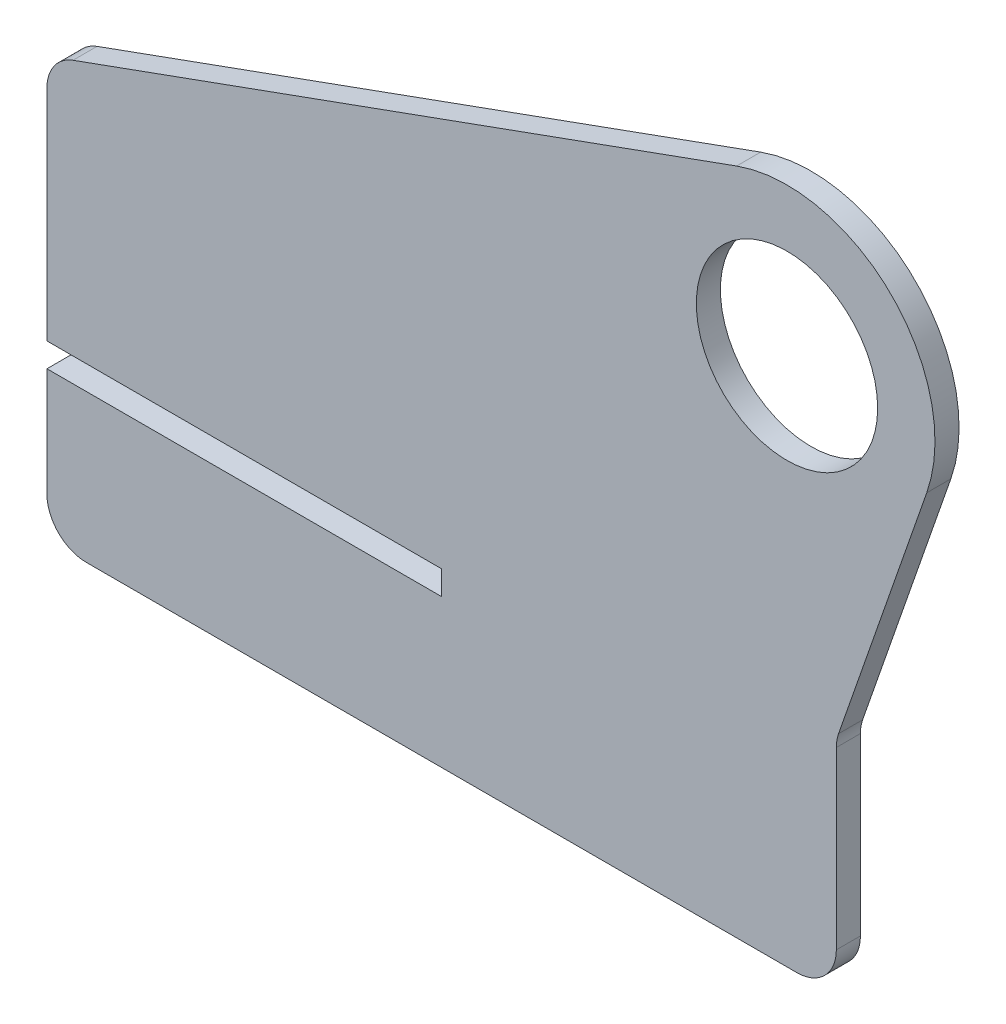
ISO-10303-21;
HEADER;
FILE_DESCRIPTION(('STEP AP214'),'2;1');
FILE_NAME('part.step','',(''),(''),'','','');
FILE_SCHEMA(('AUTOMOTIVE_DESIGN { 1 0 10303 214 1 1 1 1 }'));
ENDSEC;
DATA;
#1=APPLICATION_CONTEXT('core data for automotive mechanical design processes');
#2=APPLICATION_PROTOCOL_DEFINITION('international standard','automotive_design',2000,#1);
#3=PRODUCT_CONTEXT('',#1,'mechanical');
#4=PRODUCT('Part','Part','',(#3));
#5=PRODUCT_RELATED_PRODUCT_CATEGORY('part','',(#4));
#6=PRODUCT_DEFINITION_FORMATION('','',#4);
#7=PRODUCT_DEFINITION_CONTEXT('part definition',#1,'design');
#8=PRODUCT_DEFINITION('design','',#6,#7);
#9=PRODUCT_DEFINITION_SHAPE('','',#8);
#10=(LENGTH_UNIT() NAMED_UNIT(*) SI_UNIT(.MILLI.,.METRE.));
#11=(NAMED_UNIT(*) PLANE_ANGLE_UNIT() SI_UNIT($,.RADIAN.));
#12=(NAMED_UNIT(*) SI_UNIT($,.STERADIAN.) SOLID_ANGLE_UNIT());
#13=UNCERTAINTY_MEASURE_WITH_UNIT(LENGTH_MEASURE(1.E-05),#10,'distance_accuracy_value','');
#14=(GEOMETRIC_REPRESENTATION_CONTEXT(3) GLOBAL_UNCERTAINTY_ASSIGNED_CONTEXT((#13)) GLOBAL_UNIT_ASSIGNED_CONTEXT((#10,
#11,#12)) REPRESENTATION_CONTEXT('',''));
#15=CARTESIAN_POINT('',(0.,0.,0.));
#16=DIRECTION('',(0.,0.,1.));
#17=DIRECTION('',(1.,0.,0.));
#18=AXIS2_PLACEMENT_3D('',#15,#16,#17);
#19=CARTESIAN_POINT('',(0.,0.,3.0988));
#20=DIRECTION('',(0.,0.,-1.));
#21=DIRECTION('',(-1.,0.,0.));
#22=AXIS2_PLACEMENT_3D('',#19,#20,#21);
#23=PLANE('',#22);
#24=CARTESIAN_POINT('',(44.45,47.5190488120291,3.0988));
#25=DIRECTION('',(0.,0.,1.));
#26=DIRECTION('',(1.,0.,0.));
#27=AXIS2_PLACEMENT_3D('',#24,#25,#26);
#28=CIRCLE('',#27,11.6713);
#29=CARTESIAN_POINT('',(56.1213,47.5190488120291,3.0988));
#30=VERTEX_POINT('',#29);
#31=EDGE_CURVE('E170',#30,#30,#28,.T.);
#32=ORIENTED_EDGE('',*,*,#31,.F.);
#33=EDGE_LOOP('',(#32));
#34=FACE_BOUND('',#33,.T.);
#35=DIRECTION('',(1.,0.,0.));
#36=VECTOR('',#35,1.);
#37=CARTESIAN_POINT('',(0.,-20.5994,3.0988));
#38=LINE('',#37,#36);
#39=CARTESIAN_POINT('',(-45.72,-20.5994,3.0988));
#40=VERTEX_POINT('',#39);
#41=CARTESIAN_POINT('',(45.72,-20.5994,3.0988));
#42=VERTEX_POINT('',#41);
#43=EDGE_CURVE('E178',#40,#42,#38,.T.);
#44=ORIENTED_EDGE('',*,*,#43,.T.);
#45=CARTESIAN_POINT('',(45.72,-15.5194,3.0988));
#46=DIRECTION('',(0.,0.,-1.));
#47=DIRECTION('',(-1.,0.,0.));
#48=AXIS2_PLACEMENT_3D('',#45,#46,#47);
#49=CIRCLE('',#48,5.08);
#50=CARTESIAN_POINT('',(50.8,-15.5194,3.0988));
#51=VERTEX_POINT('',#50);
#52=EDGE_CURVE('E238',#42,#51,#49,.F.);
#53=ORIENTED_EDGE('',*,*,#52,.T.);
#54=DIRECTION('',(0.,-1.,0.));
#55=VECTOR('',#54,1.);
#56=CARTESIAN_POINT('',(50.8,0.,3.0988));
#57=LINE('',#56,#55);
#58=CARTESIAN_POINT('',(50.8,7.03843440850292,3.0988));
#59=VERTEX_POINT('',#58);
#60=EDGE_CURVE('E162',#59,#51,#57,.T.);
#61=ORIENTED_EDGE('',*,*,#60,.F.);
#62=CARTESIAN_POINT('',(55.88,7.03843440850291,3.0988));
#63=DIRECTION('',(0.,0.,-1.));
#64=DIRECTION('',(-1.,0.,0.));
#65=AXIS2_PLACEMENT_3D('',#62,#63,#64);
#66=CIRCLE('',#65,5.08);
#67=CARTESIAN_POINT('',(51.0836867309962,8.71228596272697,3.0988));
#68=VERTEX_POINT('',#67);
#69=EDGE_CURVE('E45',#59,#68,#66,.T.);
#70=ORIENTED_EDGE('',*,*,#69,.T.);
#71=DIRECTION('',(-0.32949833744568,-0.944156155315705,0.));
#72=VECTOR('',#71,1.);
#73=CARTESIAN_POINT('',(42.8272003368747,-14.9461413019488,3.0988));
#74=LINE('',#73,#72);
#75=CARTESIAN_POINT('',(62.4361747587642,41.2421054836889,3.0988));
#76=VERTEX_POINT('',#75);
#77=EDGE_CURVE('E166',#76,#68,#74,.T.);
#78=ORIENTED_EDGE('',*,*,#77,.F.);
#79=CARTESIAN_POINT('',(44.45,47.5190488120291,3.0988));
#80=DIRECTION('',(0.,0.,1.));
#81=DIRECTION('',(1.,0.,0.));
#82=AXIS2_PLACEMENT_3D('',#79,#80,#81);
#83=CIRCLE('',#82,19.05);
#84=CARTESIAN_POINT('',(37.9658806095995,65.4315778275263,3.0988));
#85=VERTEX_POINT('',#84);
#86=EDGE_CURVE('E153',#76,#85,#83,.T.);
#87=ORIENTED_EDGE('',*,*,#86,.T.);
#88=DIRECTION('',(-0.940290237033978,-0.340373721280868,0.));
#89=VECTOR('',#88,1.);
#90=CARTESIAN_POINT('',(-16.5428727921967,45.700066739764,3.0988));
#91=LINE('',#90,#89);
#92=CARTESIAN_POINT('',(-47.4490985041068,34.5123859131586,3.0988));
#93=VERTEX_POINT('',#92);
#94=EDGE_CURVE('E175',#85,#93,#91,.T.);
#95=ORIENTED_EDGE('',*,*,#94,.T.);
#96=CARTESIAN_POINT('',(-45.72,29.735711509026,3.0988));
#97=DIRECTION('',(0.,0.,-1.));
#98=DIRECTION('',(-1.,0.,0.));
#99=AXIS2_PLACEMENT_3D('',#96,#97,#98);
#100=CIRCLE('',#99,5.08);
#101=CARTESIAN_POINT('',(-50.8,29.735711509026,3.0988));
#102=VERTEX_POINT('',#101);
#103=EDGE_CURVE('E234',#93,#102,#100,.F.);
#104=ORIENTED_EDGE('',*,*,#103,.T.);
#105=DIRECTION('',(0.,-1.,0.));
#106=VECTOR('',#105,1.);
#107=CARTESIAN_POINT('',(-50.8,1.5494,3.0988));
#108=LINE('',#107,#106);
#109=CARTESIAN_POINT('',(-50.8,1.5494,3.0988));
#110=VERTEX_POINT('',#109);
#111=EDGE_CURVE('E189',#102,#110,#108,.T.);
#112=ORIENTED_EDGE('',*,*,#111,.T.);
#113=DIRECTION('',(1.,0.,0.));
#114=VECTOR('',#113,1.);
#115=CARTESIAN_POINT('',(-50.8,1.5494,3.0988));
#116=LINE('',#115,#114);
#117=CARTESIAN_POINT('',(0.,1.5494,3.0988));
#118=VERTEX_POINT('',#117);
#119=EDGE_CURVE('E191',#110,#118,#116,.T.);
#120=ORIENTED_EDGE('',*,*,#119,.T.);
#121=DIRECTION('',(0.,-1.,0.));
#122=VECTOR('',#121,1.);
#123=CARTESIAN_POINT('',(0.,1.5494,3.0988));
#124=LINE('',#123,#122);
#125=CARTESIAN_POINT('',(0.,-1.5494,3.0988));
#126=VERTEX_POINT('',#125);
#127=EDGE_CURVE('E194',#118,#126,#124,.T.);
#128=ORIENTED_EDGE('',*,*,#127,.T.);
#129=DIRECTION('',(-1.,0.,0.));
#130=VECTOR('',#129,1.);
#131=CARTESIAN_POINT('',(-50.8,-1.5494,3.0988));
#132=LINE('',#131,#130);
#133=CARTESIAN_POINT('',(-50.8,-1.5494,3.0988));
#134=VERTEX_POINT('',#133);
#135=EDGE_CURVE('E196',#126,#134,#132,.T.);
#136=ORIENTED_EDGE('',*,*,#135,.T.);
#137=DIRECTION('',(0.,-1.,0.));
#138=VECTOR('',#137,1.);
#139=CARTESIAN_POINT('',(-50.8,-7.8994,3.0988));
#140=LINE('',#139,#138);
#141=CARTESIAN_POINT('',(-50.8,-15.5194,3.0988));
#142=VERTEX_POINT('',#141);
#143=EDGE_CURVE('E198',#134,#142,#140,.T.);
#144=ORIENTED_EDGE('',*,*,#143,.T.);
#145=CARTESIAN_POINT('',(-45.72,-15.5194,3.0988));
#146=DIRECTION('',(0.,0.,-1.));
#147=DIRECTION('',(-1.,0.,0.));
#148=AXIS2_PLACEMENT_3D('',#145,#146,#147);
#149=CIRCLE('',#148,5.08);
#150=EDGE_CURVE('E236',#142,#40,#149,.F.);
#151=ORIENTED_EDGE('',*,*,#150,.T.);
#152=EDGE_LOOP('',(#44,#53,#61,#70,#78,#87,#95,#104,#112,#120,#128,#136,#144,#151));
#153=FACE_BOUND('',#152,.T.);
#154=ADVANCED_FACE('F37',(#34,#153),#23,.F.);
#155=CARTESIAN_POINT('',(0.,0.,0.));
#156=DIRECTION('',(0.,0.,-1.));
#157=DIRECTION('',(-1.,0.,0.));
#158=AXIS2_PLACEMENT_3D('',#155,#156,#157);
#159=PLANE('',#158);
#160=CARTESIAN_POINT('',(44.45,47.5190488120291,0.));
#161=DIRECTION('',(0.,0.,1.));
#162=DIRECTION('',(1.,0.,0.));
#163=AXIS2_PLACEMENT_3D('',#160,#161,#162);
#164=CIRCLE('',#163,11.6713);
#165=CARTESIAN_POINT('',(56.1213,47.5190488120291,0.));
#166=VERTEX_POINT('',#165);
#167=EDGE_CURVE('E147',#166,#166,#164,.T.);
#168=ORIENTED_EDGE('',*,*,#167,.T.);
#169=EDGE_LOOP('',(#168));
#170=FACE_BOUND('',#169,.T.);
#171=DIRECTION('',(0.,-1.,0.));
#172=VECTOR('',#171,1.);
#173=CARTESIAN_POINT('',(50.8,0.,0.));
#174=LINE('',#173,#172);
#175=CARTESIAN_POINT('',(50.8,7.03843440850292,0.));
#176=VERTEX_POINT('',#175);
#177=CARTESIAN_POINT('',(50.8,-15.5194,0.));
#178=VERTEX_POINT('',#177);
#179=EDGE_CURVE('E157',#176,#178,#174,.T.);
#180=ORIENTED_EDGE('',*,*,#179,.T.);
#181=CARTESIAN_POINT('',(45.72,-15.5194,0.));
#182=DIRECTION('',(0.,0.,-1.));
#183=DIRECTION('',(-1.,0.,0.));
#184=AXIS2_PLACEMENT_3D('',#181,#182,#183);
#185=CIRCLE('',#184,5.08);
#186=CARTESIAN_POINT('',(45.72,-20.5994,0.));
#187=VERTEX_POINT('',#186);
#188=EDGE_CURVE('E243',#178,#187,#185,.T.);
#189=ORIENTED_EDGE('',*,*,#188,.T.);
#190=DIRECTION('',(1.,0.,0.));
#191=VECTOR('',#190,1.);
#192=CARTESIAN_POINT('',(0.,-20.5994,0.));
#193=LINE('',#192,#191);
#194=CARTESIAN_POINT('',(-45.72,-20.5994,0.));
#195=VERTEX_POINT('',#194);
#196=EDGE_CURVE('E173',#195,#187,#193,.T.);
#197=ORIENTED_EDGE('',*,*,#196,.F.);
#198=CARTESIAN_POINT('',(-45.72,-15.5194,0.));
#199=DIRECTION('',(0.,0.,-1.));
#200=DIRECTION('',(-1.,0.,0.));
#201=AXIS2_PLACEMENT_3D('',#198,#199,#200);
#202=CIRCLE('',#201,5.08);
#203=CARTESIAN_POINT('',(-50.8,-15.5194,0.));
#204=VERTEX_POINT('',#203);
#205=EDGE_CURVE('E241',#195,#204,#202,.T.);
#206=ORIENTED_EDGE('',*,*,#205,.T.);
#207=DIRECTION('',(0.,-1.,0.));
#208=VECTOR('',#207,1.);
#209=CARTESIAN_POINT('',(-50.8,-7.8994,0.));
#210=LINE('',#209,#208);
#211=CARTESIAN_POINT('',(-50.8,-1.5494,0.));
#212=VERTEX_POINT('',#211);
#213=EDGE_CURVE('E192',#212,#204,#210,.T.);
#214=ORIENTED_EDGE('',*,*,#213,.F.);
#215=DIRECTION('',(-1.,0.,0.));
#216=VECTOR('',#215,1.);
#217=CARTESIAN_POINT('',(-50.8,-1.5494,0.));
#218=LINE('',#217,#216);
#219=CARTESIAN_POINT('',(0.,-1.5494,0.));
#220=VERTEX_POINT('',#219);
#221=EDGE_CURVE('E207',#220,#212,#218,.T.);
#222=ORIENTED_EDGE('',*,*,#221,.F.);
#223=DIRECTION('',(0.,-1.,0.));
#224=VECTOR('',#223,1.);
#225=CARTESIAN_POINT('',(0.,1.5494,0.));
#226=LINE('',#225,#224);
#227=CARTESIAN_POINT('',(0.,1.5494,0.));
#228=VERTEX_POINT('',#227);
#229=EDGE_CURVE('E205',#228,#220,#226,.T.);
#230=ORIENTED_EDGE('',*,*,#229,.F.);
#231=DIRECTION('',(1.,0.,0.));
#232=VECTOR('',#231,1.);
#233=CARTESIAN_POINT('',(-50.8,1.5494,0.));
#234=LINE('',#233,#232);
#235=CARTESIAN_POINT('',(-50.8,1.5494,0.));
#236=VERTEX_POINT('',#235);
#237=EDGE_CURVE('E203',#236,#228,#234,.T.);
#238=ORIENTED_EDGE('',*,*,#237,.F.);
#239=DIRECTION('',(0.,-1.,0.));
#240=VECTOR('',#239,1.);
#241=CARTESIAN_POINT('',(-50.8,1.5494,0.));
#242=LINE('',#241,#240);
#243=CARTESIAN_POINT('',(-50.8,29.735711509026,0.));
#244=VERTEX_POINT('',#243);
#245=EDGE_CURVE('E188',#244,#236,#242,.T.);
#246=ORIENTED_EDGE('',*,*,#245,.F.);
#247=CARTESIAN_POINT('',(-45.72,29.735711509026,0.));
#248=DIRECTION('',(0.,0.,-1.));
#249=DIRECTION('',(-1.,0.,0.));
#250=AXIS2_PLACEMENT_3D('',#247,#248,#249);
#251=CIRCLE('',#250,5.08);
#252=CARTESIAN_POINT('',(-47.4490985041068,34.5123859131586,0.));
#253=VERTEX_POINT('',#252);
#254=EDGE_CURVE('E52',#244,#253,#251,.T.);
#255=ORIENTED_EDGE('',*,*,#254,.T.);
#256=DIRECTION('',(-0.940290237033978,-0.340373721280868,0.));
#257=VECTOR('',#256,1.);
#258=CARTESIAN_POINT('',(-16.5428727921967,45.700066739764,0.));
#259=LINE('',#258,#257);
#260=CARTESIAN_POINT('',(37.9658806095995,65.4315778275263,0.));
#261=VERTEX_POINT('',#260);
#262=EDGE_CURVE('E143',#261,#253,#259,.T.);
#263=ORIENTED_EDGE('',*,*,#262,.F.);
#264=CARTESIAN_POINT('',(44.45,47.5190488120291,0.));
#265=DIRECTION('',(0.,0.,1.));
#266=DIRECTION('',(1.,0.,0.));
#267=AXIS2_PLACEMENT_3D('',#264,#265,#266);
#268=CIRCLE('',#267,19.05);
#269=CARTESIAN_POINT('',(62.4361747587642,41.2421054836889,0.));
#270=VERTEX_POINT('',#269);
#271=EDGE_CURVE('E136',#270,#261,#268,.T.);
#272=ORIENTED_EDGE('',*,*,#271,.F.);
#273=DIRECTION('',(-0.32949833744568,-0.944156155315705,0.));
#274=VECTOR('',#273,1.);
#275=CARTESIAN_POINT('',(42.8272003368747,-14.9461413019488,0.));
#276=LINE('',#275,#274);
#277=CARTESIAN_POINT('',(51.0836867309962,8.71228596272697,0.));
#278=VERTEX_POINT('',#277);
#279=EDGE_CURVE('E141',#270,#278,#276,.T.);
#280=ORIENTED_EDGE('',*,*,#279,.T.);
#281=CARTESIAN_POINT('',(55.88,7.03843440850291,0.));
#282=DIRECTION('',(0.,0.,-1.));
#283=DIRECTION('',(-1.,0.,0.));
#284=AXIS2_PLACEMENT_3D('',#281,#282,#283);
#285=CIRCLE('',#284,5.08);
#286=EDGE_CURVE('E11',#278,#176,#285,.F.);
#287=ORIENTED_EDGE('',*,*,#286,.T.);
#288=EDGE_LOOP('',(#180,#189,#197,#206,#214,#222,#230,#238,#246,#255,#263,#272,#280,#287));
#289=FACE_BOUND('',#288,.T.);
#290=ADVANCED_FACE('F139',(#170,#289),#159,.T.);
#291=CARTESIAN_POINT('',(-50.8,1.5494,3.0988));
#292=DIRECTION('',(1.,0.,0.));
#293=DIRECTION('',(0.,0.,-1.));
#294=AXIS2_PLACEMENT_3D('',#291,#292,#293);
#295=PLANE('',#294);
#296=ORIENTED_EDGE('',*,*,#111,.F.);
#297=DIRECTION('',(0.,0.,-1.));
#298=VECTOR('',#297,1.);
#299=CARTESIAN_POINT('',(-50.8,29.735711509026,3.0988));
#300=LINE('',#299,#298);
#301=EDGE_CURVE('E247',#102,#244,#300,.T.);
#302=ORIENTED_EDGE('',*,*,#301,.T.);
#303=ORIENTED_EDGE('',*,*,#245,.T.);
#304=DIRECTION('',(0.,0.,-1.));
#305=VECTOR('',#304,1.);
#306=CARTESIAN_POINT('',(-50.8,1.5494,3.0988));
#307=LINE('',#306,#305);
#308=EDGE_CURVE('E219',#110,#236,#307,.T.);
#309=ORIENTED_EDGE('',*,*,#308,.F.);
#310=EDGE_LOOP('',(#296,#302,#303,#309));
#311=FACE_BOUND('',#310,.T.);
#312=ADVANCED_FACE('F294',(#311),#295,.F.);
#313=CARTESIAN_POINT('',(-50.8,1.5494,3.0988));
#314=DIRECTION('',(0.,1.,0.));
#315=DIRECTION('',(-1.,0.,0.));
#316=AXIS2_PLACEMENT_3D('',#313,#314,#315);
#317=PLANE('',#316);
#318=ORIENTED_EDGE('',*,*,#237,.T.);
#319=DIRECTION('',(0.,0.,-1.));
#320=VECTOR('',#319,1.);
#321=CARTESIAN_POINT('',(0.,1.5494,3.0988));
#322=LINE('',#321,#320);
#323=EDGE_CURVE('E216',#118,#228,#322,.T.);
#324=ORIENTED_EDGE('',*,*,#323,.F.);
#325=ORIENTED_EDGE('',*,*,#119,.F.);
#326=ORIENTED_EDGE('',*,*,#308,.T.);
#327=EDGE_LOOP('',(#318,#324,#325,#326));
#328=FACE_BOUND('',#327,.T.);
#329=ADVANCED_FACE('F290',(#328),#317,.F.);
#330=CARTESIAN_POINT('',(0.,1.5494,3.0988));
#331=DIRECTION('',(1.,0.,0.));
#332=DIRECTION('',(0.,1.,0.));
#333=AXIS2_PLACEMENT_3D('',#330,#331,#332);
#334=PLANE('',#333);
#335=ORIENTED_EDGE('',*,*,#229,.T.);
#336=DIRECTION('',(0.,0.,-1.));
#337=VECTOR('',#336,1.);
#338=CARTESIAN_POINT('',(0.,-1.5494,3.0988));
#339=LINE('',#338,#337);
#340=EDGE_CURVE('E213',#126,#220,#339,.T.);
#341=ORIENTED_EDGE('',*,*,#340,.F.);
#342=ORIENTED_EDGE('',*,*,#127,.F.);
#343=ORIENTED_EDGE('',*,*,#323,.T.);
#344=EDGE_LOOP('',(#335,#341,#342,#343));
#345=FACE_BOUND('',#344,.T.);
#346=ADVANCED_FACE('F285',(#345),#334,.F.);
#347=CARTESIAN_POINT('',(-50.8,-1.5494,3.0988));
#348=DIRECTION('',(0.,-1.,0.));
#349=DIRECTION('',(1.,0.,0.));
#350=AXIS2_PLACEMENT_3D('',#347,#348,#349);
#351=PLANE('',#350);
#352=ORIENTED_EDGE('',*,*,#221,.T.);
#353=DIRECTION('',(0.,0.,-1.));
#354=VECTOR('',#353,1.);
#355=CARTESIAN_POINT('',(-50.8,-1.5494,3.0988));
#356=LINE('',#355,#354);
#357=EDGE_CURVE('E201',#134,#212,#356,.T.);
#358=ORIENTED_EDGE('',*,*,#357,.F.);
#359=ORIENTED_EDGE('',*,*,#135,.F.);
#360=ORIENTED_EDGE('',*,*,#340,.T.);
#361=EDGE_LOOP('',(#352,#358,#359,#360));
#362=FACE_BOUND('',#361,.T.);
#363=ADVANCED_FACE('F280',(#362),#351,.F.);
#364=CARTESIAN_POINT('',(-50.8,-7.8994,3.0988));
#365=DIRECTION('',(1.,0.,0.));
#366=DIRECTION('',(0.,0.,-1.));
#367=AXIS2_PLACEMENT_3D('',#364,#365,#366);
#368=PLANE('',#367);
#369=ORIENTED_EDGE('',*,*,#213,.T.);
#370=DIRECTION('',(0.,0.,-1.));
#371=VECTOR('',#370,1.);
#372=CARTESIAN_POINT('',(-50.8,-15.5194,3.0988));
#373=LINE('',#372,#371);
#374=EDGE_CURVE('E245',#204,#142,#373,.F.);
#375=ORIENTED_EDGE('',*,*,#374,.T.);
#376=ORIENTED_EDGE('',*,*,#143,.F.);
#377=ORIENTED_EDGE('',*,*,#357,.T.);
#378=EDGE_LOOP('',(#369,#375,#376,#377));
#379=FACE_BOUND('',#378,.T.);
#380=ADVANCED_FACE('F275',(#379),#368,.F.);
#381=CARTESIAN_POINT('',(44.45,47.5190488120291,3.0988));
#382=DIRECTION('',(0.,0.,-1.));
#383=DIRECTION('',(-1.,0.,0.));
#384=AXIS2_PLACEMENT_3D('',#381,#382,#383);
#385=CYLINDRICAL_SURFACE('',#384,19.05);
#386=ORIENTED_EDGE('',*,*,#271,.T.);
#387=DIRECTION('',(0.,0.,-1.));
#388=VECTOR('',#387,1.);
#389=CARTESIAN_POINT('',(37.9658806095995,65.4315778275263,3.0988));
#390=LINE('',#389,#388);
#391=EDGE_CURVE('E181',#85,#261,#390,.T.);
#392=ORIENTED_EDGE('',*,*,#391,.F.);
#393=ORIENTED_EDGE('',*,*,#86,.F.);
#394=DIRECTION('',(0.,0.,1.));
#395=VECTOR('',#394,1.);
#396=CARTESIAN_POINT('',(62.4361747587642,41.2421054836889,0.));
#397=LINE('',#396,#395);
#398=EDGE_CURVE('E150',#270,#76,#397,.T.);
#399=ORIENTED_EDGE('',*,*,#398,.F.);
#400=EDGE_LOOP('',(#386,#392,#393,#399));
#401=FACE_BOUND('',#400,.T.);
#402=ADVANCED_FACE('F151',(#401),#385,.T.);
#403=CARTESIAN_POINT('',(-16.5428727921967,45.700066739764,3.0988));
#404=DIRECTION('',(0.340373721280868,-0.940290237033977,0.));
#405=DIRECTION('',(0.940290237033978,0.340373721280868,0.));
#406=AXIS2_PLACEMENT_3D('',#403,#404,#405);
#407=PLANE('',#406);
#408=ORIENTED_EDGE('',*,*,#262,.T.);
#409=DIRECTION('',(0.,0.,-1.));
#410=VECTOR('',#409,1.);
#411=CARTESIAN_POINT('',(-47.4490985041068,34.5123859131586,3.0988));
#412=LINE('',#411,#410);
#413=EDGE_CURVE('E249',#253,#93,#412,.F.);
#414=ORIENTED_EDGE('',*,*,#413,.T.);
#415=ORIENTED_EDGE('',*,*,#94,.F.);
#416=ORIENTED_EDGE('',*,*,#391,.T.);
#417=EDGE_LOOP('',(#408,#414,#415,#416));
#418=FACE_BOUND('',#417,.T.);
#419=ADVANCED_FACE('F297',(#418),#407,.F.);
#420=CARTESIAN_POINT('',(0.,-20.5994,3.0988));
#421=DIRECTION('',(0.,1.,0.));
#422=DIRECTION('',(-1.,0.,0.));
#423=AXIS2_PLACEMENT_3D('',#420,#421,#422);
#424=PLANE('',#423);
#425=ORIENTED_EDGE('',*,*,#196,.T.);
#426=DIRECTION('',(0.,0.,1.));
#427=VECTOR('',#426,1.);
#428=CARTESIAN_POINT('',(45.72,-20.5994,3.0988));
#429=LINE('',#428,#427);
#430=EDGE_CURVE('E231',#187,#42,#429,.T.);
#431=ORIENTED_EDGE('',*,*,#430,.T.);
#432=ORIENTED_EDGE('',*,*,#43,.F.);
#433=DIRECTION('',(0.,0.,-1.));
#434=VECTOR('',#433,1.);
#435=CARTESIAN_POINT('',(-45.72,-20.5994,3.0988));
#436=LINE('',#435,#434);
#437=EDGE_CURVE('E228',#40,#195,#436,.T.);
#438=ORIENTED_EDGE('',*,*,#437,.T.);
#439=EDGE_LOOP('',(#425,#431,#432,#438));
#440=FACE_BOUND('',#439,.T.);
#441=ADVANCED_FACE('F265',(#440),#424,.F.);
#442=CARTESIAN_POINT('',(44.45,47.5190488120291,3.0988));
#443=DIRECTION('',(0.,0.,-1.));
#444=DIRECTION('',(-1.,0.,0.));
#445=AXIS2_PLACEMENT_3D('',#442,#443,#444);
#446=CYLINDRICAL_SURFACE('',#445,11.6713);
#447=ORIENTED_EDGE('',*,*,#31,.T.);
#448=EDGE_LOOP('',(#447));
#449=FACE_BOUND('',#448,.T.);
#450=ORIENTED_EDGE('',*,*,#167,.F.);
#451=EDGE_LOOP('',(#450));
#452=FACE_BOUND('',#451,.T.);
#453=ADVANCED_FACE('F304',(#449,#452),#446,.F.);
#454=CARTESIAN_POINT('',(50.8,0.,0.));
#455=DIRECTION('',(-1.,0.,0.));
#456=DIRECTION('',(0.,-1.,0.));
#457=AXIS2_PLACEMENT_3D('',#454,#455,#456);
#458=PLANE('',#457);
#459=ORIENTED_EDGE('',*,*,#179,.F.);
#460=DIRECTION('',(0.,0.,1.));
#461=VECTOR('',#460,1.);
#462=CARTESIAN_POINT('',(50.8,7.03843440850292,3.0988));
#463=LINE('',#462,#461);
#464=EDGE_CURVE('E224',#176,#59,#463,.T.);
#465=ORIENTED_EDGE('',*,*,#464,.T.);
#466=ORIENTED_EDGE('',*,*,#60,.T.);
#467=DIRECTION('',(0.,0.,1.));
#468=VECTOR('',#467,1.);
#469=CARTESIAN_POINT('',(50.8,-15.5194,0.));
#470=LINE('',#469,#468);
#471=EDGE_CURVE('E222',#51,#178,#470,.F.);
#472=ORIENTED_EDGE('',*,*,#471,.T.);
#473=EDGE_LOOP('',(#459,#465,#466,#472));
#474=FACE_BOUND('',#473,.T.);
#475=ADVANCED_FACE('F258',(#474),#458,.F.);
#476=CARTESIAN_POINT('',(42.8272003368747,-14.9461413019488,0.));
#477=DIRECTION('',(-0.944156155315705,0.32949833744568,0.));
#478=DIRECTION('',(-0.32949833744568,-0.944156155315705,0.));
#479=AXIS2_PLACEMENT_3D('',#476,#477,#478);
#480=PLANE('',#479);
#481=ORIENTED_EDGE('',*,*,#77,.T.);
#482=DIRECTION('',(0.,0.,1.));
#483=VECTOR('',#482,1.);
#484=CARTESIAN_POINT('',(51.0836867309962,8.71228596272697,0.));
#485=LINE('',#484,#483);
#486=EDGE_CURVE('E161',#68,#278,#485,.F.);
#487=ORIENTED_EDGE('',*,*,#486,.T.);
#488=ORIENTED_EDGE('',*,*,#279,.F.);
#489=ORIENTED_EDGE('',*,*,#398,.T.);
#490=EDGE_LOOP('',(#481,#487,#488,#489));
#491=FACE_BOUND('',#490,.T.);
#492=ADVANCED_FACE('F159',(#491),#480,.F.);
#493=CARTESIAN_POINT('',(55.88,7.03843440850291,0.));
#494=DIRECTION('',(0.,0.,-1.));
#495=DIRECTION('',(-1.,0.,0.));
#496=AXIS2_PLACEMENT_3D('',#493,#494,#495);
#497=CYLINDRICAL_SURFACE('',#496,5.08);
#498=ORIENTED_EDGE('',*,*,#286,.F.);
#499=ORIENTED_EDGE('',*,*,#486,.F.);
#500=ORIENTED_EDGE('',*,*,#69,.F.);
#501=ORIENTED_EDGE('',*,*,#464,.F.);
#502=EDGE_LOOP('',(#498,#499,#500,#501));
#503=FACE_BOUND('',#502,.T.);
#504=ADVANCED_FACE('F254',(#503),#497,.F.);
#505=CARTESIAN_POINT('',(45.72,-15.5194,3.0988));
#506=DIRECTION('',(0.,0.,1.));
#507=DIRECTION('',(1.,0.,0.));
#508=AXIS2_PLACEMENT_3D('',#505,#506,#507);
#509=CYLINDRICAL_SURFACE('',#508,5.08);
#510=ORIENTED_EDGE('',*,*,#188,.F.);
#511=ORIENTED_EDGE('',*,*,#471,.F.);
#512=ORIENTED_EDGE('',*,*,#52,.F.);
#513=ORIENTED_EDGE('',*,*,#430,.F.);
#514=EDGE_LOOP('',(#510,#511,#512,#513));
#515=FACE_BOUND('',#514,.T.);
#516=ADVANCED_FACE('F261',(#515),#509,.T.);
#517=CARTESIAN_POINT('',(-45.72,-15.5194,3.0988));
#518=DIRECTION('',(0.,0.,-1.));
#519=DIRECTION('',(-1.,0.,0.));
#520=AXIS2_PLACEMENT_3D('',#517,#518,#519);
#521=CYLINDRICAL_SURFACE('',#520,5.08);
#522=ORIENTED_EDGE('',*,*,#150,.F.);
#523=ORIENTED_EDGE('',*,*,#374,.F.);
#524=ORIENTED_EDGE('',*,*,#205,.F.);
#525=ORIENTED_EDGE('',*,*,#437,.F.);
#526=EDGE_LOOP('',(#522,#523,#524,#525));
#527=FACE_BOUND('',#526,.T.);
#528=ADVANCED_FACE('F270',(#527),#521,.T.);
#529=CARTESIAN_POINT('',(-45.72,29.735711509026,3.0988));
#530=DIRECTION('',(0.,0.,-1.));
#531=DIRECTION('',(-1.,0.,0.));
#532=AXIS2_PLACEMENT_3D('',#529,#530,#531);
#533=CYLINDRICAL_SURFACE('',#532,5.08);
#534=ORIENTED_EDGE('',*,*,#103,.F.);
#535=ORIENTED_EDGE('',*,*,#413,.F.);
#536=ORIENTED_EDGE('',*,*,#254,.F.);
#537=ORIENTED_EDGE('',*,*,#301,.F.);
#538=EDGE_LOOP('',(#534,#535,#536,#537));
#539=FACE_BOUND('',#538,.T.);
#540=ADVANCED_FACE('F39',(#539),#533,.T.);
#541=CLOSED_SHELL('',(#154,#290,#312,#329,#346,#363,#380,#402,#419,#441,#453,#475,#492,#504,
#516,#528,#540));
#542=MANIFOLD_SOLID_BREP('B2',#541);
#543=ADVANCED_BREP_SHAPE_REPRESENTATION('',(#18,#542),#14);
#544=SHAPE_DEFINITION_REPRESENTATION(#9,#543);
ENDSEC;
END-ISO-10303-21;
